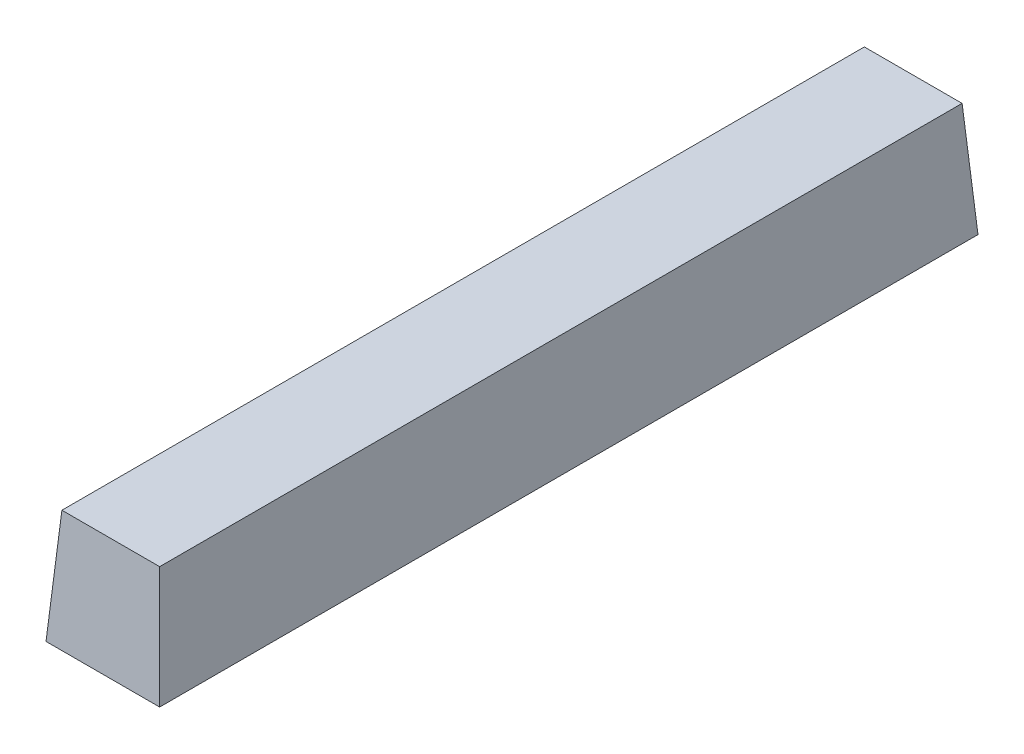
ISO-10303-21;
HEADER;
FILE_DESCRIPTION(('STEP AP214'),'2;1');
FILE_NAME('part.step','',(''),(''),'','','');
FILE_SCHEMA(('AUTOMOTIVE_DESIGN { 1 0 10303 214 1 1 1 1 }'));
ENDSEC;
DATA;
#1=APPLICATION_CONTEXT('core data for automotive mechanical design processes');
#2=APPLICATION_PROTOCOL_DEFINITION('international standard','automotive_design',2000,#1);
#3=PRODUCT_CONTEXT('',#1,'mechanical');
#4=PRODUCT('Part','Part','',(#3));
#5=PRODUCT_RELATED_PRODUCT_CATEGORY('part','',(#4));
#6=PRODUCT_DEFINITION_FORMATION('','',#4);
#7=PRODUCT_DEFINITION_CONTEXT('part definition',#1,'design');
#8=PRODUCT_DEFINITION('design','',#6,#7);
#9=PRODUCT_DEFINITION_SHAPE('','',#8);
#10=(LENGTH_UNIT() NAMED_UNIT(*) SI_UNIT(.MILLI.,.METRE.));
#11=(NAMED_UNIT(*) PLANE_ANGLE_UNIT() SI_UNIT($,.RADIAN.));
#12=(NAMED_UNIT(*) SI_UNIT($,.STERADIAN.) SOLID_ANGLE_UNIT());
#13=UNCERTAINTY_MEASURE_WITH_UNIT(LENGTH_MEASURE(1.E-05),#10,'distance_accuracy_value','');
#14=(GEOMETRIC_REPRESENTATION_CONTEXT(3) GLOBAL_UNCERTAINTY_ASSIGNED_CONTEXT((#13)) GLOBAL_UNIT_ASSIGNED_CONTEXT((#10,
#11,#12)) REPRESENTATION_CONTEXT('',''));
#15=CARTESIAN_POINT('',(0.,0.,0.));
#16=DIRECTION('',(0.,0.,1.));
#17=DIRECTION('',(1.,0.,0.));
#18=AXIS2_PLACEMENT_3D('',#15,#16,#17);
#19=CARTESIAN_POINT('',(0.,0.,0.));
#20=DIRECTION('',(-0.997564050259824,0.0697564737441253,0.));
#21=DIRECTION('',(-0.0697564737441253,-0.997564050259824,0.));
#22=AXIS2_PLACEMENT_3D('',#19,#20,#21);
#23=PLANE('',#22);
#24=DIRECTION('',(0.,0.,1.));
#25=VECTOR('',#24,1.);
#26=CARTESIAN_POINT('',(0.,0.,0.));
#27=LINE('',#26,#25);
#28=CARTESIAN_POINT('',(0.,0.,0.));
#29=VERTEX_POINT('',#28);
#30=CARTESIAN_POINT('',(0.,0.,72.));
#31=VERTEX_POINT('',#30);
#32=EDGE_CURVE('E91',#29,#31,#27,.T.);
#33=ORIENTED_EDGE('',*,*,#32,.T.);
#34=DIRECTION('',(-0.0695873743166647,-0.995145815783508,0.0695873743166647));
#35=VECTOR('',#34,1.);
#36=CARTESIAN_POINT('',(0.,0.,72.));
#37=LINE('',#36,#35);
#38=CARTESIAN_POINT('',(0.699268119435113,10.,71.3007318805649));
#39=VERTEX_POINT('',#38);
#40=EDGE_CURVE('E11',#39,#31,#37,.T.);
#41=ORIENTED_EDGE('',*,*,#40,.F.);
#42=DIRECTION('',(0.,0.,-1.));
#43=VECTOR('',#42,1.);
#44=CARTESIAN_POINT('',(0.699268119435104,10.,0.));
#45=LINE('',#44,#43);
#46=CARTESIAN_POINT('',(0.699268119435105,10.,0.699268119435105));
#47=VERTEX_POINT('',#46);
#48=EDGE_CURVE('E111',#47,#39,#45,.F.);
#49=ORIENTED_EDGE('',*,*,#48,.F.);
#50=DIRECTION('',(-0.0695873743166647,-0.995145815783508,-0.0695873743166647));
#51=VECTOR('',#50,1.);
#52=CARTESIAN_POINT('',(0.,0.,0.));
#53=LINE('',#52,#51);
#54=EDGE_CURVE('E103',#47,#29,#53,.T.);
#55=ORIENTED_EDGE('',*,*,#54,.T.);
#56=EDGE_LOOP('',(#33,#41,#49,#55));
#57=FACE_BOUND('',#56,.T.);
#58=ADVANCED_FACE('F44',(#57),#23,.T.);
#59=CARTESIAN_POINT('',(0.,0.,72.));
#60=DIRECTION('',(0.,0.0697564737441253,0.997564050259824));
#61=DIRECTION('',(0.,-0.997564050259824,0.0697564737441253));
#62=AXIS2_PLACEMENT_3D('',#59,#60,#61);
#63=PLANE('',#62);
#64=DIRECTION('',(1.,0.,0.));
#65=VECTOR('',#64,1.);
#66=CARTESIAN_POINT('',(0.,0.,72.));
#67=LINE('',#66,#65);
#68=CARTESIAN_POINT('',(10.,0.,72.));
#69=VERTEX_POINT('',#68);
#70=EDGE_CURVE('E87',#31,#69,#67,.T.);
#71=ORIENTED_EDGE('',*,*,#70,.T.);
#72=DIRECTION('',(0.0695873743166647,-0.995145815783508,0.0695873743166647));
#73=VECTOR('',#72,1.);
#74=CARTESIAN_POINT('',(9.6513470081713,4.98597007554646,71.6513470081713));
#75=LINE('',#74,#73);
#76=CARTESIAN_POINT('',(9.3007318805649,10.,71.3007318805649));
#77=VERTEX_POINT('',#76);
#78=EDGE_CURVE('E54',#77,#69,#75,.T.);
#79=ORIENTED_EDGE('',*,*,#78,.F.);
#80=DIRECTION('',(-1.,0.,0.));
#81=VECTOR('',#80,1.);
#82=CARTESIAN_POINT('',(0.,10.,71.3007318805649));
#83=LINE('',#82,#81);
#84=EDGE_CURVE('E99',#39,#77,#83,.F.);
#85=ORIENTED_EDGE('',*,*,#84,.F.);
#86=ORIENTED_EDGE('',*,*,#40,.T.);
#87=EDGE_LOOP('',(#71,#79,#85,#86));
#88=FACE_BOUND('',#87,.T.);
#89=ADVANCED_FACE('F46',(#88),#63,.T.);
#90=CARTESIAN_POINT('',(10.,0.,0.));
#91=DIRECTION('',(0.997564050259824,0.0697564737441253,0.));
#92=DIRECTION('',(-0.0697564737441253,0.997564050259824,0.));
#93=AXIS2_PLACEMENT_3D('',#90,#91,#92);
#94=PLANE('',#93);
#95=DIRECTION('',(0.,0.,-1.));
#96=VECTOR('',#95,1.);
#97=CARTESIAN_POINT('',(10.,0.,0.));
#98=LINE('',#97,#96);
#99=CARTESIAN_POINT('',(10.,0.,0.));
#100=VERTEX_POINT('',#99);
#101=EDGE_CURVE('E92',#69,#100,#98,.T.);
#102=ORIENTED_EDGE('',*,*,#101,.T.);
#103=DIRECTION('',(0.0695873743166647,-0.995145815783508,-0.0695873743166647));
#104=VECTOR('',#103,1.);
#105=CARTESIAN_POINT('',(9.95157597335712,0.692495843825897,0.0484240266428761));
#106=LINE('',#105,#104);
#107=CARTESIAN_POINT('',(9.30073188056489,10.,0.699268119435105));
#108=VERTEX_POINT('',#107);
#109=EDGE_CURVE('E115',#108,#100,#106,.T.);
#110=ORIENTED_EDGE('',*,*,#109,.F.);
#111=DIRECTION('',(0.,0.,1.));
#112=VECTOR('',#111,1.);
#113=CARTESIAN_POINT('',(9.30073188056489,10.,0.));
#114=LINE('',#113,#112);
#115=EDGE_CURVE('E66',#77,#108,#114,.F.);
#116=ORIENTED_EDGE('',*,*,#115,.F.);
#117=ORIENTED_EDGE('',*,*,#78,.T.);
#118=EDGE_LOOP('',(#102,#110,#116,#117));
#119=FACE_BOUND('',#118,.T.);
#120=ADVANCED_FACE('F128',(#119),#94,.T.);
#121=CARTESIAN_POINT('',(0.,0.,0.));
#122=DIRECTION('',(0.,0.0697564737441253,-0.997564050259824));
#123=DIRECTION('',(0.,0.997564050259824,0.0697564737441253));
#124=AXIS2_PLACEMENT_3D('',#121,#122,#123);
#125=PLANE('',#124);
#126=DIRECTION('',(-1.,0.,0.));
#127=VECTOR('',#126,1.);
#128=CARTESIAN_POINT('',(0.,0.,0.));
#129=LINE('',#128,#127);
#130=EDGE_CURVE('E109',#100,#29,#129,.T.);
#131=ORIENTED_EDGE('',*,*,#130,.T.);
#132=ORIENTED_EDGE('',*,*,#54,.F.);
#133=DIRECTION('',(1.,0.,0.));
#134=VECTOR('',#133,1.);
#135=CARTESIAN_POINT('',(0.,10.,0.699268119435104));
#136=LINE('',#135,#134);
#137=EDGE_CURVE('E48',#108,#47,#136,.F.);
#138=ORIENTED_EDGE('',*,*,#137,.F.);
#139=ORIENTED_EDGE('',*,*,#109,.T.);
#140=EDGE_LOOP('',(#131,#132,#138,#139));
#141=FACE_BOUND('',#140,.T.);
#142=ADVANCED_FACE('F130',(#141),#125,.T.);
#143=CARTESIAN_POINT('',(0.,10.,0.));
#144=DIRECTION('',(0.,1.,0.));
#145=DIRECTION('',(0.,0.,1.));
#146=AXIS2_PLACEMENT_3D('',#143,#144,#145);
#147=PLANE('',#146);
#148=ORIENTED_EDGE('',*,*,#48,.T.);
#149=ORIENTED_EDGE('',*,*,#84,.T.);
#150=ORIENTED_EDGE('',*,*,#115,.T.);
#151=ORIENTED_EDGE('',*,*,#137,.T.);
#152=EDGE_LOOP('',(#148,#149,#150,#151));
#153=FACE_BOUND('',#152,.T.);
#154=ADVANCED_FACE('F126',(#153),#147,.T.);
#155=CARTESIAN_POINT('',(0.,0.,0.));
#156=DIRECTION('',(0.,1.,0.));
#157=DIRECTION('',(0.,0.,1.));
#158=AXIS2_PLACEMENT_3D('',#155,#156,#157);
#159=PLANE('',#158);
#160=ORIENTED_EDGE('',*,*,#32,.F.);
#161=ORIENTED_EDGE('',*,*,#130,.F.);
#162=ORIENTED_EDGE('',*,*,#101,.F.);
#163=ORIENTED_EDGE('',*,*,#70,.F.);
#164=EDGE_LOOP('',(#160,#161,#162,#163));
#165=FACE_BOUND('',#164,.T.);
#166=ADVANCED_FACE('F88',(#165),#159,.F.);
#167=CLOSED_SHELL('',(#58,#89,#120,#142,#154,#166));
#168=MANIFOLD_SOLID_BREP('B2',#167);
#169=ADVANCED_BREP_SHAPE_REPRESENTATION('',(#18,#168),#14);
#170=SHAPE_DEFINITION_REPRESENTATION(#9,#169);
ENDSEC;
END-ISO-10303-21;
